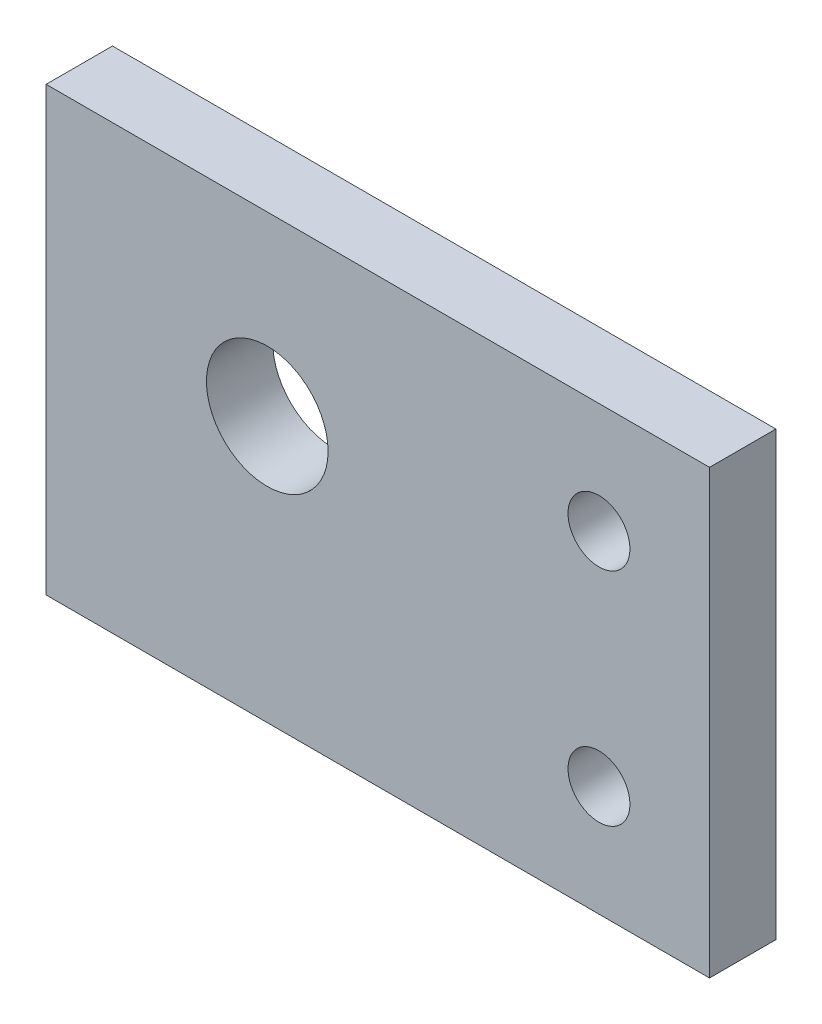
ISO-10303-21;
HEADER;
FILE_DESCRIPTION(('STEP AP214'),'2;1');
FILE_NAME('part.step','',(''),(''),'','','');
FILE_SCHEMA(('AUTOMOTIVE_DESIGN { 1 0 10303 214 1 1 1 1 }'));
ENDSEC;
DATA;
#1=APPLICATION_CONTEXT('core data for automotive mechanical design processes');
#2=APPLICATION_PROTOCOL_DEFINITION('international standard','automotive_design',2000,#1);
#3=PRODUCT_CONTEXT('',#1,'mechanical');
#4=PRODUCT('Part','Part','',(#3));
#5=PRODUCT_RELATED_PRODUCT_CATEGORY('part','',(#4));
#6=PRODUCT_DEFINITION_FORMATION('','',#4);
#7=PRODUCT_DEFINITION_CONTEXT('part definition',#1,'design');
#8=PRODUCT_DEFINITION('design','',#6,#7);
#9=PRODUCT_DEFINITION_SHAPE('','',#8);
#10=(LENGTH_UNIT() NAMED_UNIT(*) SI_UNIT(.MILLI.,.METRE.));
#11=(NAMED_UNIT(*) PLANE_ANGLE_UNIT() SI_UNIT($,.RADIAN.));
#12=(NAMED_UNIT(*) SI_UNIT($,.STERADIAN.) SOLID_ANGLE_UNIT());
#13=UNCERTAINTY_MEASURE_WITH_UNIT(LENGTH_MEASURE(1.E-05),#10,'distance_accuracy_value','');
#14=(GEOMETRIC_REPRESENTATION_CONTEXT(3) GLOBAL_UNCERTAINTY_ASSIGNED_CONTEXT((#13)) GLOBAL_UNIT_ASSIGNED_CONTEXT((#10,
#11,#12)) REPRESENTATION_CONTEXT('',''));
#15=CARTESIAN_POINT('',(0.,0.,0.));
#16=DIRECTION('',(0.,0.,1.));
#17=DIRECTION('',(1.,0.,0.));
#18=AXIS2_PLACEMENT_3D('',#15,#16,#17);
#19=CARTESIAN_POINT('',(0.,0.,3.));
#20=DIRECTION('',(0.,0.,1.));
#21=DIRECTION('',(1.,0.,0.));
#22=AXIS2_PLACEMENT_3D('',#19,#20,#21);
#23=PLANE('',#22);
#24=CARTESIAN_POINT('',(0.645161290322552,10.9677419354839,3.));
#25=DIRECTION('',(0.,0.,1.));
#26=DIRECTION('',(1.,0.,0.));
#27=AXIS2_PLACEMENT_3D('',#24,#25,#26);
#28=CIRCLE('',#27,1.4);
#29=CARTESIAN_POINT('',(2.04516129032255,10.9677419354839,3.));
#30=VERTEX_POINT('',#29);
#31=EDGE_CURVE('E140',#30,#30,#28,.T.);
#32=ORIENTED_EDGE('',*,*,#31,.F.);
#33=EDGE_LOOP('',(#32));
#34=FACE_BOUND('',#33,.T.);
#35=DIRECTION('',(0.,-1.,0.));
#36=VECTOR('',#35,1.);
#37=CARTESIAN_POINT('',(-24.3548387096774,15.9677419354839,3.));
#38=LINE('',#37,#36);
#39=CARTESIAN_POINT('',(-24.3548387096774,15.9677419354839,3.));
#40=VERTEX_POINT('',#39);
#41=CARTESIAN_POINT('',(-24.3548387096774,-4.03225806451613,3.));
#42=VERTEX_POINT('',#41);
#43=EDGE_CURVE('E98',#40,#42,#38,.T.);
#44=ORIENTED_EDGE('',*,*,#43,.T.);
#45=DIRECTION('',(1.,0.,0.));
#46=VECTOR('',#45,1.);
#47=CARTESIAN_POINT('',(-24.3548387096774,-4.03225806451613,3.));
#48=LINE('',#47,#46);
#49=CARTESIAN_POINT('',(5.64516129032255,-4.03225806451613,3.));
#50=VERTEX_POINT('',#49);
#51=EDGE_CURVE('E93',#42,#50,#48,.T.);
#52=ORIENTED_EDGE('',*,*,#51,.T.);
#53=DIRECTION('',(0.,1.,0.));
#54=VECTOR('',#53,1.);
#55=CARTESIAN_POINT('',(5.64516129032255,15.9677419354839,3.));
#56=LINE('',#55,#54);
#57=CARTESIAN_POINT('',(5.64516129032255,15.9677419354839,3.));
#58=VERTEX_POINT('',#57);
#59=EDGE_CURVE('E96',#50,#58,#56,.T.);
#60=ORIENTED_EDGE('',*,*,#59,.T.);
#61=DIRECTION('',(-1.,0.,0.));
#62=VECTOR('',#61,1.);
#63=CARTESIAN_POINT('',(-24.3548387096774,15.9677419354839,3.));
#64=LINE('',#63,#62);
#65=EDGE_CURVE('E63',#58,#40,#64,.T.);
#66=ORIENTED_EDGE('',*,*,#65,.T.);
#67=EDGE_LOOP('',(#44,#52,#60,#66));
#68=FACE_BOUND('',#67,.T.);
#69=CARTESIAN_POINT('',(-14.3548387096774,7.96774193548387,3.));
#70=DIRECTION('',(0.,0.,1.));
#71=DIRECTION('',(1.,0.,0.));
#72=AXIS2_PLACEMENT_3D('',#69,#70,#71);
#73=CIRCLE('',#72,2.75);
#74=CARTESIAN_POINT('',(-11.6048387096774,7.96774193548387,3.));
#75=VERTEX_POINT('',#74);
#76=EDGE_CURVE('E118',#75,#75,#73,.T.);
#77=ORIENTED_EDGE('',*,*,#76,.F.);
#78=EDGE_LOOP('',(#77));
#79=FACE_BOUND('',#78,.T.);
#80=CARTESIAN_POINT('',(0.645161290322555,0.967741935483874,3.));
#81=DIRECTION('',(0.,0.,1.));
#82=DIRECTION('',(1.,0.,0.));
#83=AXIS2_PLACEMENT_3D('',#80,#81,#82);
#84=CIRCLE('',#83,1.4);
#85=CARTESIAN_POINT('',(2.04516129032256,0.967741935483874,3.));
#86=VERTEX_POINT('',#85);
#87=EDGE_CURVE('E148',#86,#86,#84,.T.);
#88=ORIENTED_EDGE('',*,*,#87,.F.);
#89=EDGE_LOOP('',(#88));
#90=FACE_BOUND('',#89,.T.);
#91=ADVANCED_FACE('F45',(#34,#68,#79,#90),#23,.T.);
#92=CARTESIAN_POINT('',(0.,0.,0.));
#93=DIRECTION('',(0.,0.,1.));
#94=DIRECTION('',(1.,0.,0.));
#95=AXIS2_PLACEMENT_3D('',#92,#93,#94);
#96=PLANE('',#95);
#97=DIRECTION('',(0.,-1.,0.));
#98=VECTOR('',#97,1.);
#99=CARTESIAN_POINT('',(-24.3548387096774,15.9677419354839,0.));
#100=LINE('',#99,#98);
#101=CARTESIAN_POINT('',(-24.3548387096774,15.9677419354839,0.));
#102=VERTEX_POINT('',#101);
#103=CARTESIAN_POINT('',(-24.3548387096774,-4.03225806451613,0.));
#104=VERTEX_POINT('',#103);
#105=EDGE_CURVE('E114',#102,#104,#100,.T.);
#106=ORIENTED_EDGE('',*,*,#105,.F.);
#107=DIRECTION('',(-1.,0.,0.));
#108=VECTOR('',#107,1.);
#109=CARTESIAN_POINT('',(-24.3548387096774,15.9677419354839,0.));
#110=LINE('',#109,#108);
#111=CARTESIAN_POINT('',(5.64516129032255,15.9677419354839,0.));
#112=VERTEX_POINT('',#111);
#113=EDGE_CURVE('E86',#112,#102,#110,.T.);
#114=ORIENTED_EDGE('',*,*,#113,.F.);
#115=DIRECTION('',(0.,1.,0.));
#116=VECTOR('',#115,1.);
#117=CARTESIAN_POINT('',(5.64516129032255,15.9677419354839,0.));
#118=LINE('',#117,#116);
#119=CARTESIAN_POINT('',(5.64516129032255,-4.03225806451613,0.));
#120=VERTEX_POINT('',#119);
#121=EDGE_CURVE('E80',#120,#112,#118,.T.);
#122=ORIENTED_EDGE('',*,*,#121,.F.);
#123=DIRECTION('',(1.,0.,0.));
#124=VECTOR('',#123,1.);
#125=CARTESIAN_POINT('',(-24.3548387096774,-4.03225806451613,0.));
#126=LINE('',#125,#124);
#127=EDGE_CURVE('E103',#104,#120,#126,.T.);
#128=ORIENTED_EDGE('',*,*,#127,.F.);
#129=EDGE_LOOP('',(#106,#114,#122,#128));
#130=FACE_BOUND('',#129,.T.);
#131=CARTESIAN_POINT('',(-14.3548387096774,7.96774193548387,0.));
#132=DIRECTION('',(0.,0.,1.));
#133=DIRECTION('',(1.,0.,0.));
#134=AXIS2_PLACEMENT_3D('',#131,#132,#133);
#135=CIRCLE('',#134,2.75);
#136=CARTESIAN_POINT('',(-11.6048387096774,7.96774193548387,0.));
#137=VERTEX_POINT('',#136);
#138=EDGE_CURVE('E136',#137,#137,#135,.T.);
#139=ORIENTED_EDGE('',*,*,#138,.T.);
#140=EDGE_LOOP('',(#139));
#141=FACE_BOUND('',#140,.T.);
#142=CARTESIAN_POINT('',(0.645161290322552,10.9677419354839,0.));
#143=DIRECTION('',(0.,0.,1.));
#144=DIRECTION('',(1.,0.,0.));
#145=AXIS2_PLACEMENT_3D('',#142,#143,#144);
#146=CIRCLE('',#145,1.4);
#147=CARTESIAN_POINT('',(2.04516129032255,10.9677419354839,0.));
#148=VERTEX_POINT('',#147);
#149=EDGE_CURVE('E144',#148,#148,#146,.T.);
#150=ORIENTED_EDGE('',*,*,#149,.T.);
#151=EDGE_LOOP('',(#150));
#152=FACE_BOUND('',#151,.T.);
#153=CARTESIAN_POINT('',(0.645161290322555,0.967741935483874,0.));
#154=DIRECTION('',(0.,0.,1.));
#155=DIRECTION('',(1.,0.,0.));
#156=AXIS2_PLACEMENT_3D('',#153,#154,#155);
#157=CIRCLE('',#156,1.4);
#158=CARTESIAN_POINT('',(2.04516129032256,0.967741935483874,0.));
#159=VERTEX_POINT('',#158);
#160=EDGE_CURVE('E152',#159,#159,#157,.T.);
#161=ORIENTED_EDGE('',*,*,#160,.T.);
#162=EDGE_LOOP('',(#161));
#163=FACE_BOUND('',#162,.T.);
#164=ADVANCED_FACE('F131',(#130,#141,#152,#163),#96,.F.);
#165=CARTESIAN_POINT('',(-24.3548387096774,15.9677419354839,3.));
#166=DIRECTION('',(1.,0.,0.));
#167=DIRECTION('',(0.,1.,0.));
#168=AXIS2_PLACEMENT_3D('',#165,#166,#167);
#169=PLANE('',#168);
#170=ORIENTED_EDGE('',*,*,#105,.T.);
#171=DIRECTION('',(0.,0.,-1.));
#172=VECTOR('',#171,1.);
#173=CARTESIAN_POINT('',(-24.3548387096774,-4.03225806451613,3.));
#174=LINE('',#173,#172);
#175=EDGE_CURVE('E11',#42,#104,#174,.T.);
#176=ORIENTED_EDGE('',*,*,#175,.F.);
#177=ORIENTED_EDGE('',*,*,#43,.F.);
#178=DIRECTION('',(0.,0.,-1.));
#179=VECTOR('',#178,1.);
#180=CARTESIAN_POINT('',(-24.3548387096774,15.9677419354839,3.));
#181=LINE('',#180,#179);
#182=EDGE_CURVE('E110',#40,#102,#181,.T.);
#183=ORIENTED_EDGE('',*,*,#182,.T.);
#184=EDGE_LOOP('',(#170,#176,#177,#183));
#185=FACE_BOUND('',#184,.T.);
#186=ADVANCED_FACE('F47',(#185),#169,.F.);
#187=CARTESIAN_POINT('',(-24.3548387096774,-4.03225806451613,3.));
#188=DIRECTION('',(0.,1.,0.));
#189=DIRECTION('',(0.,0.,1.));
#190=AXIS2_PLACEMENT_3D('',#187,#188,#189);
#191=PLANE('',#190);
#192=ORIENTED_EDGE('',*,*,#127,.T.);
#193=DIRECTION('',(0.,0.,-1.));
#194=VECTOR('',#193,1.);
#195=CARTESIAN_POINT('',(5.64516129032255,-4.03225806451613,3.));
#196=LINE('',#195,#194);
#197=EDGE_CURVE('E55',#50,#120,#196,.T.);
#198=ORIENTED_EDGE('',*,*,#197,.F.);
#199=ORIENTED_EDGE('',*,*,#51,.F.);
#200=ORIENTED_EDGE('',*,*,#175,.T.);
#201=EDGE_LOOP('',(#192,#198,#199,#200));
#202=FACE_BOUND('',#201,.T.);
#203=ADVANCED_FACE('F102',(#202),#191,.F.);
#204=CARTESIAN_POINT('',(5.64516129032255,15.9677419354839,3.));
#205=DIRECTION('',(-1.,0.,0.));
#206=DIRECTION('',(0.,0.,1.));
#207=AXIS2_PLACEMENT_3D('',#204,#205,#206);
#208=PLANE('',#207);
#209=ORIENTED_EDGE('',*,*,#121,.T.);
#210=DIRECTION('',(0.,0.,-1.));
#211=VECTOR('',#210,1.);
#212=CARTESIAN_POINT('',(5.64516129032255,15.9677419354839,3.));
#213=LINE('',#212,#211);
#214=EDGE_CURVE('E105',#58,#112,#213,.T.);
#215=ORIENTED_EDGE('',*,*,#214,.F.);
#216=ORIENTED_EDGE('',*,*,#59,.F.);
#217=ORIENTED_EDGE('',*,*,#197,.T.);
#218=EDGE_LOOP('',(#209,#215,#216,#217));
#219=FACE_BOUND('',#218,.T.);
#220=ADVANCED_FACE('F106',(#219),#208,.F.);
#221=CARTESIAN_POINT('',(-24.3548387096774,15.9677419354839,3.));
#222=DIRECTION('',(0.,-1.,0.));
#223=DIRECTION('',(0.,0.,-1.));
#224=AXIS2_PLACEMENT_3D('',#221,#222,#223);
#225=PLANE('',#224);
#226=ORIENTED_EDGE('',*,*,#113,.T.);
#227=ORIENTED_EDGE('',*,*,#182,.F.);
#228=ORIENTED_EDGE('',*,*,#65,.F.);
#229=ORIENTED_EDGE('',*,*,#214,.T.);
#230=EDGE_LOOP('',(#226,#227,#228,#229));
#231=FACE_BOUND('',#230,.T.);
#232=ADVANCED_FACE('F128',(#231),#225,.F.);
#233=CARTESIAN_POINT('',(-14.3548387096774,7.96774193548387,3.));
#234=DIRECTION('',(0.,0.,-1.));
#235=DIRECTION('',(-1.,0.,0.));
#236=AXIS2_PLACEMENT_3D('',#233,#234,#235);
#237=CYLINDRICAL_SURFACE('',#236,2.75);
#238=ORIENTED_EDGE('',*,*,#76,.T.);
#239=EDGE_LOOP('',(#238));
#240=FACE_BOUND('',#239,.T.);
#241=ORIENTED_EDGE('',*,*,#138,.F.);
#242=EDGE_LOOP('',(#241));
#243=FACE_BOUND('',#242,.T.);
#244=ADVANCED_FACE('F172',(#240,#243),#237,.F.);
#245=CARTESIAN_POINT('',(0.645161290322552,10.9677419354839,3.));
#246=DIRECTION('',(0.,0.,-1.));
#247=DIRECTION('',(-1.,0.,0.));
#248=AXIS2_PLACEMENT_3D('',#245,#246,#247);
#249=CYLINDRICAL_SURFACE('',#248,1.4);
#250=ORIENTED_EDGE('',*,*,#31,.T.);
#251=EDGE_LOOP('',(#250));
#252=FACE_BOUND('',#251,.T.);
#253=ORIENTED_EDGE('',*,*,#149,.F.);
#254=EDGE_LOOP('',(#253));
#255=FACE_BOUND('',#254,.T.);
#256=ADVANCED_FACE('F217',(#252,#255),#249,.F.);
#257=CARTESIAN_POINT('',(0.645161290322555,0.967741935483874,3.));
#258=DIRECTION('',(0.,0.,-1.));
#259=DIRECTION('',(-1.,0.,0.));
#260=AXIS2_PLACEMENT_3D('',#257,#258,#259);
#261=CYLINDRICAL_SURFACE('',#260,1.4);
#262=ORIENTED_EDGE('',*,*,#87,.T.);
#263=EDGE_LOOP('',(#262));
#264=FACE_BOUND('',#263,.T.);
#265=ORIENTED_EDGE('',*,*,#160,.F.);
#266=EDGE_LOOP('',(#265));
#267=FACE_BOUND('',#266,.T.);
#268=ADVANCED_FACE('F160',(#264,#267),#261,.F.);
#269=CLOSED_SHELL('',(#91,#164,#186,#203,#220,#232,#244,#256,#268));
#270=MANIFOLD_SOLID_BREP('B2',#269);
#271=ADVANCED_BREP_SHAPE_REPRESENTATION('',(#18,#270),#14);
#272=SHAPE_DEFINITION_REPRESENTATION(#9,#271);
ENDSEC;
END-ISO-10303-21;
